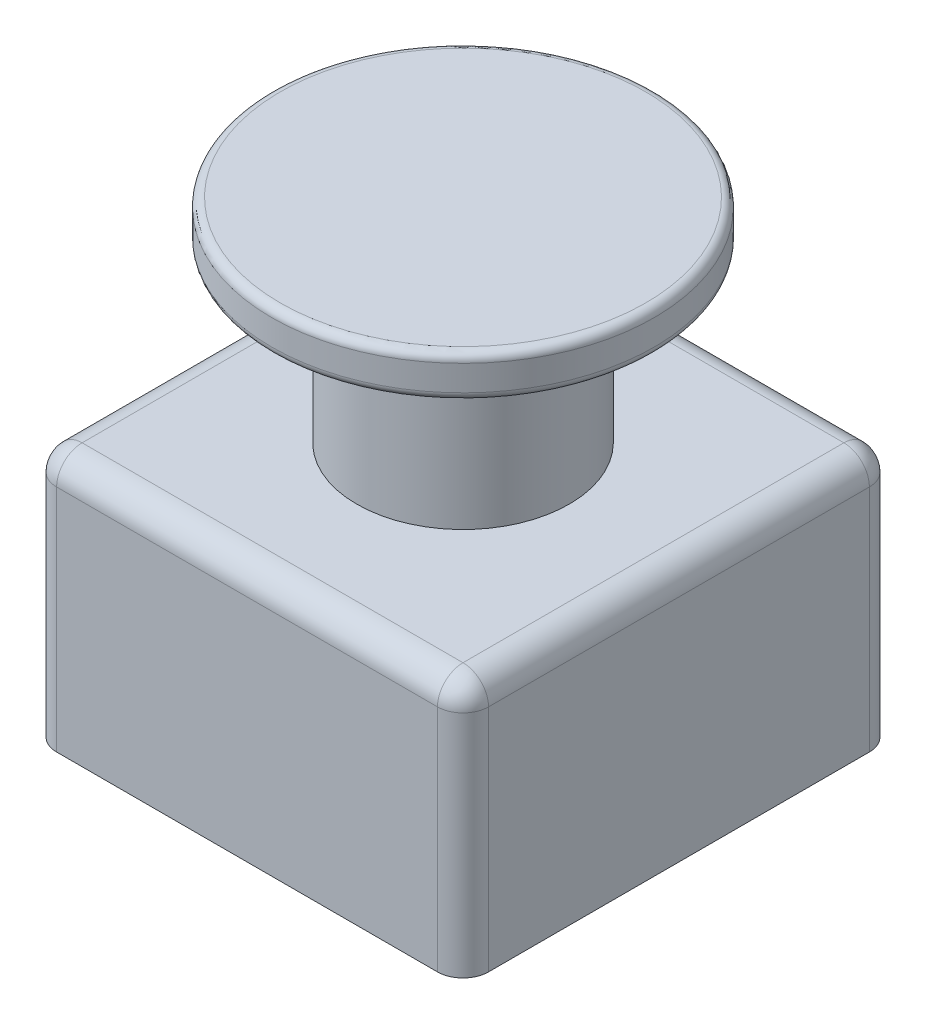
ISO-10303-21;
HEADER;
FILE_DESCRIPTION(('STEP AP214'),'2;1');
FILE_NAME('part.step','',(''),(''),'','','');
FILE_SCHEMA(('AUTOMOTIVE_DESIGN { 1 0 10303 214 1 1 1 1 }'));
ENDSEC;
DATA;
#1=APPLICATION_CONTEXT('core data for automotive mechanical design processes');
#2=APPLICATION_PROTOCOL_DEFINITION('international standard','automotive_design',2000,#1);
#3=PRODUCT_CONTEXT('',#1,'mechanical');
#4=PRODUCT('Part','Part','',(#3));
#5=PRODUCT_RELATED_PRODUCT_CATEGORY('part','',(#4));
#6=PRODUCT_DEFINITION_FORMATION('','',#4);
#7=PRODUCT_DEFINITION_CONTEXT('part definition',#1,'design');
#8=PRODUCT_DEFINITION('design','',#6,#7);
#9=PRODUCT_DEFINITION_SHAPE('','',#8);
#10=(LENGTH_UNIT() NAMED_UNIT(*) SI_UNIT(.MILLI.,.METRE.));
#11=(NAMED_UNIT(*) PLANE_ANGLE_UNIT() SI_UNIT($,.RADIAN.));
#12=(NAMED_UNIT(*) SI_UNIT($,.STERADIAN.) SOLID_ANGLE_UNIT());
#13=UNCERTAINTY_MEASURE_WITH_UNIT(LENGTH_MEASURE(1.E-05),#10,'distance_accuracy_value','');
#14=(GEOMETRIC_REPRESENTATION_CONTEXT(3) GLOBAL_UNCERTAINTY_ASSIGNED_CONTEXT((#13)) GLOBAL_UNIT_ASSIGNED_CONTEXT((#10,
#11,#12)) REPRESENTATION_CONTEXT('',''));
#15=CARTESIAN_POINT('',(0.,0.,0.));
#16=DIRECTION('',(0.,0.,1.));
#17=DIRECTION('',(1.,0.,0.));
#18=AXIS2_PLACEMENT_3D('',#15,#16,#17);
#19=CARTESIAN_POINT('',(25.4,-30.,-25.4));
#20=DIRECTION('',(1.,0.,0.));
#21=DIRECTION('',(0.,0.,-1.));
#22=AXIS2_PLACEMENT_3D('',#19,#20,#21);
#23=PLANE('',#22);
#24=DIRECTION('',(0.,0.,-1.));
#25=VECTOR('',#24,1.);
#26=CARTESIAN_POINT('',(25.4,-30.,-25.4));
#27=LINE('',#26,#25);
#28=CARTESIAN_POINT('',(25.4,-30.,22.4));
#29=VERTEX_POINT('',#28);
#30=CARTESIAN_POINT('',(25.4,-30.,-22.4));
#31=VERTEX_POINT('',#30);
#32=EDGE_CURVE('E315',#29,#31,#27,.T.);
#33=ORIENTED_EDGE('',*,*,#32,.T.);
#34=DIRECTION('',(0.,1.,0.));
#35=VECTOR('',#34,1.);
#36=CARTESIAN_POINT('',(25.4,-30.,-22.4));
#37=LINE('',#36,#35);
#38=CARTESIAN_POINT('',(25.4,-3.,-22.4));
#39=VERTEX_POINT('',#38);
#40=EDGE_CURVE('E153',#31,#39,#37,.T.);
#41=ORIENTED_EDGE('',*,*,#40,.T.);
#42=DIRECTION('',(0.,0.,-1.));
#43=VECTOR('',#42,1.);
#44=CARTESIAN_POINT('',(25.4,-3.,-25.4));
#45=LINE('',#44,#43);
#46=CARTESIAN_POINT('',(25.4,-3.,22.4));
#47=VERTEX_POINT('',#46);
#48=EDGE_CURVE('E117',#39,#47,#45,.F.);
#49=ORIENTED_EDGE('',*,*,#48,.T.);
#50=DIRECTION('',(0.,1.,0.));
#51=VECTOR('',#50,1.);
#52=CARTESIAN_POINT('',(25.4,-30.,22.4));
#53=LINE('',#52,#51);
#54=EDGE_CURVE('E146',#47,#29,#53,.F.);
#55=ORIENTED_EDGE('',*,*,#54,.T.);
#56=EDGE_LOOP('',(#33,#41,#49,#55));
#57=FACE_BOUND('',#56,.T.);
#58=ADVANCED_FACE('F33',(#57),#23,.T.);
#59=CARTESIAN_POINT('',(-25.4,-30.,25.4));
#60=DIRECTION('',(0.,0.,1.));
#61=DIRECTION('',(1.,0.,0.));
#62=AXIS2_PLACEMENT_3D('',#59,#60,#61);
#63=PLANE('',#62);
#64=DIRECTION('',(1.,0.,0.));
#65=VECTOR('',#64,1.);
#66=CARTESIAN_POINT('',(-25.4,-3.,25.4));
#67=LINE('',#66,#65);
#68=CARTESIAN_POINT('',(22.4,-3.,25.4));
#69=VERTEX_POINT('',#68);
#70=CARTESIAN_POINT('',(-22.4,-3.,25.4));
#71=VERTEX_POINT('',#70);
#72=EDGE_CURVE('E157',#69,#71,#67,.F.);
#73=ORIENTED_EDGE('',*,*,#72,.T.);
#74=DIRECTION('',(0.,1.,0.));
#75=VECTOR('',#74,1.);
#76=CARTESIAN_POINT('',(-22.4,-30.,25.4));
#77=LINE('',#76,#75);
#78=CARTESIAN_POINT('',(-22.4,-30.,25.4));
#79=VERTEX_POINT('',#78);
#80=EDGE_CURVE('E159',#71,#79,#77,.F.);
#81=ORIENTED_EDGE('',*,*,#80,.T.);
#82=DIRECTION('',(1.,0.,0.));
#83=VECTOR('',#82,1.);
#84=CARTESIAN_POINT('',(-25.4,-30.,25.4));
#85=LINE('',#84,#83);
#86=CARTESIAN_POINT('',(22.4,-30.,25.4));
#87=VERTEX_POINT('',#86);
#88=EDGE_CURVE('E308',#79,#87,#85,.T.);
#89=ORIENTED_EDGE('',*,*,#88,.T.);
#90=DIRECTION('',(0.,1.,0.));
#91=VECTOR('',#90,1.);
#92=CARTESIAN_POINT('',(22.4,-30.,25.4));
#93=LINE('',#92,#91);
#94=EDGE_CURVE('E155',#87,#69,#93,.T.);
#95=ORIENTED_EDGE('',*,*,#94,.T.);
#96=EDGE_LOOP('',(#73,#81,#89,#95));
#97=FACE_BOUND('',#96,.T.);
#98=ADVANCED_FACE('F239',(#97),#63,.T.);
#99=CARTESIAN_POINT('',(-25.4,-30.,-25.4));
#100=DIRECTION('',(-1.,0.,0.));
#101=DIRECTION('',(0.,0.,1.));
#102=AXIS2_PLACEMENT_3D('',#99,#100,#101);
#103=PLANE('',#102);
#104=DIRECTION('',(0.,0.,1.));
#105=VECTOR('',#104,1.);
#106=CARTESIAN_POINT('',(-25.4,-3.,-25.4));
#107=LINE('',#106,#105);
#108=CARTESIAN_POINT('',(-25.4,-3.,22.4));
#109=VERTEX_POINT('',#108);
#110=CARTESIAN_POINT('',(-25.4,-3.,-22.4));
#111=VERTEX_POINT('',#110);
#112=EDGE_CURVE('E163',#109,#111,#107,.F.);
#113=ORIENTED_EDGE('',*,*,#112,.T.);
#114=DIRECTION('',(0.,1.,0.));
#115=VECTOR('',#114,1.);
#116=CARTESIAN_POINT('',(-25.4,-30.,-22.4));
#117=LINE('',#116,#115);
#118=CARTESIAN_POINT('',(-25.4,-30.,-22.4));
#119=VERTEX_POINT('',#118);
#120=EDGE_CURVE('E165',#111,#119,#117,.F.);
#121=ORIENTED_EDGE('',*,*,#120,.T.);
#122=DIRECTION('',(0.,0.,1.));
#123=VECTOR('',#122,1.);
#124=CARTESIAN_POINT('',(-25.4,-30.,-25.4));
#125=LINE('',#124,#123);
#126=CARTESIAN_POINT('',(-25.4,-30.,22.4));
#127=VERTEX_POINT('',#126);
#128=EDGE_CURVE('E305',#119,#127,#125,.T.);
#129=ORIENTED_EDGE('',*,*,#128,.T.);
#130=DIRECTION('',(0.,1.,0.));
#131=VECTOR('',#130,1.);
#132=CARTESIAN_POINT('',(-25.4,-30.,22.4));
#133=LINE('',#132,#131);
#134=EDGE_CURVE('E161',#127,#109,#133,.T.);
#135=ORIENTED_EDGE('',*,*,#134,.T.);
#136=EDGE_LOOP('',(#113,#121,#129,#135));
#137=FACE_BOUND('',#136,.T.);
#138=ADVANCED_FACE('F245',(#137),#103,.T.);
#139=CARTESIAN_POINT('',(-25.4,-30.,-25.4));
#140=DIRECTION('',(0.,0.,-1.));
#141=DIRECTION('',(-1.,0.,0.));
#142=AXIS2_PLACEMENT_3D('',#139,#140,#141);
#143=PLANE('',#142);
#144=DIRECTION('',(-1.,0.,0.));
#145=VECTOR('',#144,1.);
#146=CARTESIAN_POINT('',(-25.4,-3.,-25.4));
#147=LINE('',#146,#145);
#148=CARTESIAN_POINT('',(-22.4,-3.,-25.4));
#149=VERTEX_POINT('',#148);
#150=CARTESIAN_POINT('',(22.4,-3.,-25.4));
#151=VERTEX_POINT('',#150);
#152=EDGE_CURVE('E48',#149,#151,#147,.F.);
#153=ORIENTED_EDGE('',*,*,#152,.T.);
#154=DIRECTION('',(0.,1.,0.));
#155=VECTOR('',#154,1.);
#156=CARTESIAN_POINT('',(22.4,-30.,-25.4));
#157=LINE('',#156,#155);
#158=CARTESIAN_POINT('',(22.4,-30.,-25.4));
#159=VERTEX_POINT('',#158);
#160=EDGE_CURVE('E169',#151,#159,#157,.F.);
#161=ORIENTED_EDGE('',*,*,#160,.T.);
#162=DIRECTION('',(-1.,0.,0.));
#163=VECTOR('',#162,1.);
#164=CARTESIAN_POINT('',(-25.4,-30.,-25.4));
#165=LINE('',#164,#163);
#166=CARTESIAN_POINT('',(-22.4,-30.,-25.4));
#167=VERTEX_POINT('',#166);
#168=EDGE_CURVE('E312',#159,#167,#165,.T.);
#169=ORIENTED_EDGE('',*,*,#168,.T.);
#170=DIRECTION('',(0.,1.,0.));
#171=VECTOR('',#170,1.);
#172=CARTESIAN_POINT('',(-22.4,-30.,-25.4));
#173=LINE('',#172,#171);
#174=EDGE_CURVE('E53',#167,#149,#173,.T.);
#175=ORIENTED_EDGE('',*,*,#174,.T.);
#176=EDGE_LOOP('',(#153,#161,#169,#175));
#177=FACE_BOUND('',#176,.T.);
#178=ADVANCED_FACE('F251',(#177),#143,.T.);
#179=CARTESIAN_POINT('',(0.,-30.,0.));
#180=DIRECTION('',(0.,1.,0.));
#181=DIRECTION('',(0.,0.,1.));
#182=AXIS2_PLACEMENT_3D('',#179,#180,#181);
#183=PLANE('',#182);
#184=ORIENTED_EDGE('',*,*,#168,.F.);
#185=CARTESIAN_POINT('',(22.4,-30.,-22.4));
#186=DIRECTION('',(0.,1.,0.));
#187=DIRECTION('',(0.,0.,1.));
#188=AXIS2_PLACEMENT_3D('',#185,#186,#187);
#189=CIRCLE('',#188,3.);
#190=EDGE_CURVE('E177',#159,#31,#189,.F.);
#191=ORIENTED_EDGE('',*,*,#190,.T.);
#192=ORIENTED_EDGE('',*,*,#32,.F.);
#193=CARTESIAN_POINT('',(22.4,-30.,22.4));
#194=DIRECTION('',(0.,1.,0.));
#195=DIRECTION('',(0.,0.,1.));
#196=AXIS2_PLACEMENT_3D('',#193,#194,#195);
#197=CIRCLE('',#196,3.);
#198=EDGE_CURVE('E171',#29,#87,#197,.F.);
#199=ORIENTED_EDGE('',*,*,#198,.T.);
#200=ORIENTED_EDGE('',*,*,#88,.F.);
#201=CARTESIAN_POINT('',(-22.4,-30.,22.4));
#202=DIRECTION('',(0.,1.,0.));
#203=DIRECTION('',(0.,0.,1.));
#204=AXIS2_PLACEMENT_3D('',#201,#202,#203);
#205=CIRCLE('',#204,3.);
#206=EDGE_CURVE('E173',#79,#127,#205,.F.);
#207=ORIENTED_EDGE('',*,*,#206,.T.);
#208=ORIENTED_EDGE('',*,*,#128,.F.);
#209=CARTESIAN_POINT('',(-22.4,-30.,-22.4));
#210=DIRECTION('',(0.,1.,0.));
#211=DIRECTION('',(0.,0.,1.));
#212=AXIS2_PLACEMENT_3D('',#209,#210,#211);
#213=CIRCLE('',#212,3.);
#214=EDGE_CURVE('E175',#119,#167,#213,.F.);
#215=ORIENTED_EDGE('',*,*,#214,.T.);
#216=EDGE_LOOP('',(#184,#191,#192,#199,#200,#207,#208,#215));
#217=FACE_BOUND('',#216,.T.);
#218=ADVANCED_FACE('F304',(#217),#183,.F.);
#219=CARTESIAN_POINT('',(0.,0.,0.));
#220=DIRECTION('',(0.,1.,0.));
#221=DIRECTION('',(0.,0.,1.));
#222=AXIS2_PLACEMENT_3D('',#219,#220,#221);
#223=PLANE('',#222);
#224=DIRECTION('',(1.,0.,0.));
#225=VECTOR('',#224,1.);
#226=CARTESIAN_POINT('',(0.,0.,22.4));
#227=LINE('',#226,#225);
#228=CARTESIAN_POINT('',(-22.4,0.,22.4));
#229=VERTEX_POINT('',#228);
#230=CARTESIAN_POINT('',(22.4,0.,22.4));
#231=VERTEX_POINT('',#230);
#232=EDGE_CURVE('E144',#229,#231,#227,.T.);
#233=ORIENTED_EDGE('',*,*,#232,.T.);
#234=DIRECTION('',(0.,0.,-1.));
#235=VECTOR('',#234,1.);
#236=CARTESIAN_POINT('',(22.4,0.,0.));
#237=LINE('',#236,#235);
#238=CARTESIAN_POINT('',(22.4,0.,-22.4));
#239=VERTEX_POINT('',#238);
#240=EDGE_CURVE('E115',#231,#239,#237,.T.);
#241=ORIENTED_EDGE('',*,*,#240,.T.);
#242=DIRECTION('',(-1.,0.,0.));
#243=VECTOR('',#242,1.);
#244=CARTESIAN_POINT('',(0.,0.,-22.4));
#245=LINE('',#244,#243);
#246=CARTESIAN_POINT('',(-22.4,0.,-22.4));
#247=VERTEX_POINT('',#246);
#248=EDGE_CURVE('E132',#239,#247,#245,.T.);
#249=ORIENTED_EDGE('',*,*,#248,.T.);
#250=DIRECTION('',(0.,0.,1.));
#251=VECTOR('',#250,1.);
#252=CARTESIAN_POINT('',(-22.4,0.,0.));
#253=LINE('',#252,#251);
#254=EDGE_CURVE('E138',#247,#229,#253,.T.);
#255=ORIENTED_EDGE('',*,*,#254,.T.);
#256=EDGE_LOOP('',(#233,#241,#249,#255));
#257=FACE_BOUND('',#256,.T.);
#258=CARTESIAN_POINT('',(0.,0.,0.));
#259=DIRECTION('',(0.,1.,0.));
#260=DIRECTION('',(0.,0.,1.));
#261=AXIS2_PLACEMENT_3D('',#258,#259,#260);
#262=CIRCLE('',#261,12.5);
#263=CARTESIAN_POINT('',(0.,0.,12.5));
#264=VERTEX_POINT('',#263);
#265=EDGE_CURVE('E139',#264,#264,#262,.T.);
#266=ORIENTED_EDGE('',*,*,#265,.F.);
#267=EDGE_LOOP('',(#266));
#268=FACE_BOUND('',#267,.T.);
#269=ADVANCED_FACE('F141',(#257,#268),#223,.T.);
#270=CARTESIAN_POINT('',(0.,20.,0.));
#271=DIRECTION('',(0.,-1.,0.));
#272=DIRECTION('',(0.,0.,-1.));
#273=AXIS2_PLACEMENT_3D('',#270,#271,#272);
#274=CYLINDRICAL_SURFACE('',#273,12.5);
#275=CARTESIAN_POINT('',(0.,20.,0.));
#276=DIRECTION('',(0.,1.,0.));
#277=DIRECTION('',(0.,0.,1.));
#278=AXIS2_PLACEMENT_3D('',#275,#276,#277);
#279=CIRCLE('',#278,12.5);
#280=CARTESIAN_POINT('',(0.,20.,12.5));
#281=VERTEX_POINT('',#280);
#282=EDGE_CURVE('E203',#281,#281,#279,.T.);
#283=ORIENTED_EDGE('',*,*,#282,.F.);
#284=EDGE_LOOP('',(#283));
#285=FACE_BOUND('',#284,.T.);
#286=ORIENTED_EDGE('',*,*,#265,.T.);
#287=EDGE_LOOP('',(#286));
#288=FACE_BOUND('',#287,.T.);
#289=ADVANCED_FACE('F223',(#285,#288),#274,.T.);
#290=CARTESIAN_POINT('',(0.,25.,0.));
#291=DIRECTION('',(0.,-1.,0.));
#292=DIRECTION('',(0.,0.,-1.));
#293=AXIS2_PLACEMENT_3D('',#290,#291,#292);
#294=CYLINDRICAL_SURFACE('',#293,22.5);
#295=CARTESIAN_POINT('',(0.,21.,0.));
#296=DIRECTION('',(0.,1.,0.));
#297=DIRECTION('',(0.,0.,1.));
#298=AXIS2_PLACEMENT_3D('',#295,#296,#297);
#299=CIRCLE('',#298,22.5);
#300=CARTESIAN_POINT('',(0.,21.,22.5));
#301=VERTEX_POINT('',#300);
#302=EDGE_CURVE('E206',#301,#301,#299,.T.);
#303=ORIENTED_EDGE('',*,*,#302,.T.);
#304=EDGE_LOOP('',(#303));
#305=FACE_BOUND('',#304,.T.);
#306=CARTESIAN_POINT('',(0.,24.,0.));
#307=DIRECTION('',(0.,1.,0.));
#308=DIRECTION('',(0.,0.,1.));
#309=AXIS2_PLACEMENT_3D('',#306,#307,#308);
#310=CIRCLE('',#309,22.5);
#311=CARTESIAN_POINT('',(0.,24.,22.5));
#312=VERTEX_POINT('',#311);
#313=EDGE_CURVE('E178',#312,#312,#310,.F.);
#314=ORIENTED_EDGE('',*,*,#313,.T.);
#315=EDGE_LOOP('',(#314));
#316=FACE_BOUND('',#315,.T.);
#317=ADVANCED_FACE('F219',(#305,#316),#294,.T.);
#318=CARTESIAN_POINT('',(0.,25.,0.));
#319=DIRECTION('',(0.,1.,0.));
#320=DIRECTION('',(0.,0.,1.));
#321=AXIS2_PLACEMENT_3D('',#318,#319,#320);
#322=PLANE('',#321);
#323=CARTESIAN_POINT('',(0.,25.,0.));
#324=DIRECTION('',(0.,1.,0.));
#325=DIRECTION('',(0.,0.,1.));
#326=AXIS2_PLACEMENT_3D('',#323,#324,#325);
#327=CIRCLE('',#326,21.5);
#328=CARTESIAN_POINT('',(0.,25.,21.5));
#329=VERTEX_POINT('',#328);
#330=EDGE_CURVE('E11',#329,#329,#327,.T.);
#331=ORIENTED_EDGE('',*,*,#330,.T.);
#332=EDGE_LOOP('',(#331));
#333=FACE_BOUND('',#332,.T.);
#334=ADVANCED_FACE('F222',(#333),#322,.T.);
#335=CARTESIAN_POINT('',(0.,20.,0.));
#336=DIRECTION('',(0.,1.,0.));
#337=DIRECTION('',(0.,0.,1.));
#338=AXIS2_PLACEMENT_3D('',#335,#336,#337);
#339=PLANE('',#338);
#340=CARTESIAN_POINT('',(0.,20.,0.));
#341=DIRECTION('',(0.,1.,0.));
#342=DIRECTION('',(0.,0.,1.));
#343=AXIS2_PLACEMENT_3D('',#340,#341,#342);
#344=CIRCLE('',#343,21.5);
#345=CARTESIAN_POINT('',(0.,20.,21.5));
#346=VERTEX_POINT('',#345);
#347=EDGE_CURVE('E41',#346,#346,#344,.F.);
#348=ORIENTED_EDGE('',*,*,#347,.T.);
#349=EDGE_LOOP('',(#348));
#350=FACE_BOUND('',#349,.T.);
#351=ORIENTED_EDGE('',*,*,#282,.T.);
#352=EDGE_LOOP('',(#351));
#353=FACE_BOUND('',#352,.T.);
#354=ADVANCED_FACE('F211',(#350,#353),#339,.F.);
#355=CARTESIAN_POINT('',(-22.4,-30.,22.4));
#356=DIRECTION('',(0.,1.,0.));
#357=DIRECTION('',(0.,0.,1.));
#358=AXIS2_PLACEMENT_3D('',#355,#356,#357);
#359=CYLINDRICAL_SURFACE('',#358,3.);
#360=ORIENTED_EDGE('',*,*,#206,.F.);
#361=ORIENTED_EDGE('',*,*,#80,.F.);
#362=CARTESIAN_POINT('',(-22.4,-3.,22.4));
#363=DIRECTION('',(0.,1.,0.));
#364=DIRECTION('',(0.,0.,1.));
#365=AXIS2_PLACEMENT_3D('',#362,#363,#364);
#366=CIRCLE('',#365,3.);
#367=EDGE_CURVE('E200',#109,#71,#366,.T.);
#368=ORIENTED_EDGE('',*,*,#367,.F.);
#369=ORIENTED_EDGE('',*,*,#134,.F.);
#370=EDGE_LOOP('',(#360,#361,#368,#369));
#371=FACE_BOUND('',#370,.T.);
#372=ADVANCED_FACE('F236',(#371),#359,.T.);
#373=CARTESIAN_POINT('',(-22.4,-3.,0.));
#374=DIRECTION('',(0.,0.,1.));
#375=DIRECTION('',(1.,0.,0.));
#376=AXIS2_PLACEMENT_3D('',#373,#374,#375);
#377=CYLINDRICAL_SURFACE('',#376,3.);
#378=CARTESIAN_POINT('',(-22.4,-3.,-22.4));
#379=DIRECTION('',(0.,0.,-1.));
#380=DIRECTION('',(-1.,0.,0.));
#381=AXIS2_PLACEMENT_3D('',#378,#379,#380);
#382=CIRCLE('',#381,3.);
#383=EDGE_CURVE('E194',#111,#247,#382,.T.);
#384=ORIENTED_EDGE('',*,*,#383,.F.);
#385=ORIENTED_EDGE('',*,*,#112,.F.);
#386=CARTESIAN_POINT('',(-22.4,-3.,22.4));
#387=DIRECTION('',(0.,0.,1.));
#388=DIRECTION('',(1.,0.,0.));
#389=AXIS2_PLACEMENT_3D('',#386,#387,#388);
#390=CIRCLE('',#389,3.);
#391=EDGE_CURVE('E197',#229,#109,#390,.T.);
#392=ORIENTED_EDGE('',*,*,#391,.F.);
#393=ORIENTED_EDGE('',*,*,#254,.F.);
#394=EDGE_LOOP('',(#384,#385,#392,#393));
#395=FACE_BOUND('',#394,.T.);
#396=ADVANCED_FACE('F286',(#395),#377,.T.);
#397=CARTESIAN_POINT('',(-22.4,-30.,-22.4));
#398=DIRECTION('',(0.,1.,0.));
#399=DIRECTION('',(0.,0.,1.));
#400=AXIS2_PLACEMENT_3D('',#397,#398,#399);
#401=CYLINDRICAL_SURFACE('',#400,3.);
#402=ORIENTED_EDGE('',*,*,#214,.F.);
#403=ORIENTED_EDGE('',*,*,#120,.F.);
#404=CARTESIAN_POINT('',(-22.4,-3.,-22.4));
#405=DIRECTION('',(0.,1.,0.));
#406=DIRECTION('',(0.,0.,1.));
#407=AXIS2_PLACEMENT_3D('',#404,#405,#406);
#408=CIRCLE('',#407,3.);
#409=EDGE_CURVE('E191',#149,#111,#408,.T.);
#410=ORIENTED_EDGE('',*,*,#409,.F.);
#411=ORIENTED_EDGE('',*,*,#174,.F.);
#412=EDGE_LOOP('',(#402,#403,#410,#411));
#413=FACE_BOUND('',#412,.T.);
#414=ADVANCED_FACE('F282',(#413),#401,.T.);
#415=CARTESIAN_POINT('',(-22.4,-3.,22.4));
#416=DIRECTION('',(-1.,0.,0.));
#417=DIRECTION('',(0.,0.,1.));
#418=AXIS2_PLACEMENT_3D('',#415,#416,#417);
#419=SPHERICAL_SURFACE('',#418,3.);
#420=ORIENTED_EDGE('',*,*,#391,.T.);
#421=ORIENTED_EDGE('',*,*,#367,.T.);
#422=CARTESIAN_POINT('',(-22.4,-3.,22.4));
#423=DIRECTION('',(-1.,0.,0.));
#424=DIRECTION('',(0.,0.,1.));
#425=AXIS2_PLACEMENT_3D('',#422,#423,#424);
#426=CIRCLE('',#425,3.);
#427=EDGE_CURVE('E188',#229,#71,#426,.F.);
#428=ORIENTED_EDGE('',*,*,#427,.F.);
#429=EDGE_LOOP('',(#420,#421,#428));
#430=FACE_BOUND('',#429,.T.);
#431=ADVANCED_FACE('F278',(#430),#419,.T.);
#432=CARTESIAN_POINT('',(-22.4,-3.,-22.4));
#433=DIRECTION('',(-1.,0.,0.));
#434=DIRECTION('',(0.,0.,1.));
#435=AXIS2_PLACEMENT_3D('',#432,#433,#434);
#436=SPHERICAL_SURFACE('',#435,3.);
#437=ORIENTED_EDGE('',*,*,#409,.T.);
#438=ORIENTED_EDGE('',*,*,#383,.T.);
#439=CARTESIAN_POINT('',(-22.4,-3.,-22.4));
#440=DIRECTION('',(-1.,0.,0.));
#441=DIRECTION('',(0.,0.,1.));
#442=AXIS2_PLACEMENT_3D('',#439,#440,#441);
#443=CIRCLE('',#442,3.);
#444=EDGE_CURVE('E135',#149,#247,#443,.F.);
#445=ORIENTED_EDGE('',*,*,#444,.F.);
#446=EDGE_LOOP('',(#437,#438,#445));
#447=FACE_BOUND('',#446,.T.);
#448=ADVANCED_FACE('F274',(#447),#436,.T.);
#449=CARTESIAN_POINT('',(22.4,-30.,22.4));
#450=DIRECTION('',(0.,1.,0.));
#451=DIRECTION('',(0.,0.,1.));
#452=AXIS2_PLACEMENT_3D('',#449,#450,#451);
#453=CYLINDRICAL_SURFACE('',#452,3.);
#454=ORIENTED_EDGE('',*,*,#198,.F.);
#455=ORIENTED_EDGE('',*,*,#54,.F.);
#456=CARTESIAN_POINT('',(22.4,-3.,22.4));
#457=DIRECTION('',(0.,1.,0.));
#458=DIRECTION('',(0.,0.,1.));
#459=AXIS2_PLACEMENT_3D('',#456,#457,#458);
#460=CIRCLE('',#459,3.);
#461=EDGE_CURVE('E184',#69,#47,#460,.T.);
#462=ORIENTED_EDGE('',*,*,#461,.F.);
#463=ORIENTED_EDGE('',*,*,#94,.F.);
#464=EDGE_LOOP('',(#454,#455,#462,#463));
#465=FACE_BOUND('',#464,.T.);
#466=ADVANCED_FACE('F270',(#465),#453,.T.);
#467=CARTESIAN_POINT('',(0.,-3.,22.4));
#468=DIRECTION('',(1.,0.,0.));
#469=DIRECTION('',(0.,0.,-1.));
#470=AXIS2_PLACEMENT_3D('',#467,#468,#469);
#471=CYLINDRICAL_SURFACE('',#470,3.);
#472=ORIENTED_EDGE('',*,*,#427,.T.);
#473=ORIENTED_EDGE('',*,*,#72,.F.);
#474=CARTESIAN_POINT('',(22.4,-3.,22.4));
#475=DIRECTION('',(1.,0.,0.));
#476=DIRECTION('',(0.,0.,-1.));
#477=AXIS2_PLACEMENT_3D('',#474,#475,#476);
#478=CIRCLE('',#477,3.);
#479=EDGE_CURVE('E129',#231,#69,#478,.T.);
#480=ORIENTED_EDGE('',*,*,#479,.F.);
#481=ORIENTED_EDGE('',*,*,#232,.F.);
#482=EDGE_LOOP('',(#472,#473,#480,#481));
#483=FACE_BOUND('',#482,.T.);
#484=ADVANCED_FACE('F267',(#483),#471,.T.);
#485=CARTESIAN_POINT('',(0.,-3.,-22.4));
#486=DIRECTION('',(-1.,0.,0.));
#487=DIRECTION('',(0.,0.,1.));
#488=AXIS2_PLACEMENT_3D('',#485,#486,#487);
#489=CYLINDRICAL_SURFACE('',#488,3.);
#490=ORIENTED_EDGE('',*,*,#444,.T.);
#491=ORIENTED_EDGE('',*,*,#248,.F.);
#492=CARTESIAN_POINT('',(22.4,-3.,-22.4));
#493=DIRECTION('',(1.,0.,0.));
#494=DIRECTION('',(0.,1.,0.));
#495=AXIS2_PLACEMENT_3D('',#492,#493,#494);
#496=CIRCLE('',#495,3.);
#497=EDGE_CURVE('E123',#151,#239,#496,.T.);
#498=ORIENTED_EDGE('',*,*,#497,.F.);
#499=ORIENTED_EDGE('',*,*,#152,.F.);
#500=EDGE_LOOP('',(#490,#491,#498,#499));
#501=FACE_BOUND('',#500,.T.);
#502=ADVANCED_FACE('F133',(#501),#489,.T.);
#503=CARTESIAN_POINT('',(22.4,-30.,-22.4));
#504=DIRECTION('',(0.,1.,0.));
#505=DIRECTION('',(0.,0.,1.));
#506=AXIS2_PLACEMENT_3D('',#503,#504,#505);
#507=CYLINDRICAL_SURFACE('',#506,3.);
#508=ORIENTED_EDGE('',*,*,#190,.F.);
#509=ORIENTED_EDGE('',*,*,#160,.F.);
#510=CARTESIAN_POINT('',(22.4,-3.,-22.4));
#511=DIRECTION('',(0.,1.,0.));
#512=DIRECTION('',(0.,0.,1.));
#513=AXIS2_PLACEMENT_3D('',#510,#511,#512);
#514=CIRCLE('',#513,3.);
#515=EDGE_CURVE('E127',#39,#151,#514,.T.);
#516=ORIENTED_EDGE('',*,*,#515,.F.);
#517=ORIENTED_EDGE('',*,*,#40,.F.);
#518=EDGE_LOOP('',(#508,#509,#516,#517));
#519=FACE_BOUND('',#518,.T.);
#520=ADVANCED_FACE('F260',(#519),#507,.T.);
#521=CARTESIAN_POINT('',(22.4,-3.,22.4));
#522=DIRECTION('',(0.,0.,1.));
#523=DIRECTION('',(1.,0.,0.));
#524=AXIS2_PLACEMENT_3D('',#521,#522,#523);
#525=SPHERICAL_SURFACE('',#524,3.);
#526=ORIENTED_EDGE('',*,*,#479,.T.);
#527=ORIENTED_EDGE('',*,*,#461,.T.);
#528=CARTESIAN_POINT('',(22.4,-3.,22.4));
#529=DIRECTION('',(0.,0.,1.));
#530=DIRECTION('',(1.,0.,0.));
#531=AXIS2_PLACEMENT_3D('',#528,#529,#530);
#532=CIRCLE('',#531,3.);
#533=EDGE_CURVE('E120',#231,#47,#532,.F.);
#534=ORIENTED_EDGE('',*,*,#533,.F.);
#535=EDGE_LOOP('',(#526,#527,#534));
#536=FACE_BOUND('',#535,.T.);
#537=ADVANCED_FACE('F257',(#536),#525,.T.);
#538=CARTESIAN_POINT('',(22.4,-3.,-22.4));
#539=DIRECTION('',(0.,0.,-1.));
#540=DIRECTION('',(-1.,0.,0.));
#541=AXIS2_PLACEMENT_3D('',#538,#539,#540);
#542=SPHERICAL_SURFACE('',#541,3.);
#543=ORIENTED_EDGE('',*,*,#515,.T.);
#544=ORIENTED_EDGE('',*,*,#497,.T.);
#545=CARTESIAN_POINT('',(22.4,-3.,-22.4));
#546=DIRECTION('',(0.,0.,-1.));
#547=DIRECTION('',(-1.,0.,0.));
#548=AXIS2_PLACEMENT_3D('',#545,#546,#547);
#549=CIRCLE('',#548,3.);
#550=EDGE_CURVE('E111',#39,#239,#549,.F.);
#551=ORIENTED_EDGE('',*,*,#550,.F.);
#552=EDGE_LOOP('',(#543,#544,#551));
#553=FACE_BOUND('',#552,.T.);
#554=ADVANCED_FACE('F125',(#553),#542,.T.);
#555=CARTESIAN_POINT('',(22.4,-3.,0.));
#556=DIRECTION('',(0.,0.,-1.));
#557=DIRECTION('',(-1.,0.,0.));
#558=AXIS2_PLACEMENT_3D('',#555,#556,#557);
#559=CYLINDRICAL_SURFACE('',#558,3.);
#560=ORIENTED_EDGE('',*,*,#533,.T.);
#561=ORIENTED_EDGE('',*,*,#48,.F.);
#562=ORIENTED_EDGE('',*,*,#550,.T.);
#563=ORIENTED_EDGE('',*,*,#240,.F.);
#564=EDGE_LOOP('',(#560,#561,#562,#563));
#565=FACE_BOUND('',#564,.T.);
#566=ADVANCED_FACE('F113',(#565),#559,.T.);
#567=CARTESIAN_POINT('',(0.,21.,0.));
#568=DIRECTION('',(0.,1.,0.));
#569=DIRECTION('',(0.,0.,1.));
#570=AXIS2_PLACEMENT_3D('',#567,#568,#569);
#571=TOROIDAL_SURFACE('',#570,21.5,1.);
#572=ORIENTED_EDGE('',*,*,#347,.F.);
#573=EDGE_LOOP('',(#572));
#574=FACE_BOUND('',#573,.T.);
#575=ORIENTED_EDGE('',*,*,#302,.F.);
#576=EDGE_LOOP('',(#575));
#577=FACE_BOUND('',#576,.T.);
#578=ADVANCED_FACE('F214',(#574,#577),#571,.T.);
#579=CARTESIAN_POINT('',(0.,24.,0.));
#580=DIRECTION('',(0.,1.,0.));
#581=DIRECTION('',(0.,0.,1.));
#582=AXIS2_PLACEMENT_3D('',#579,#580,#581);
#583=TOROIDAL_SURFACE('',#582,21.5,1.);
#584=ORIENTED_EDGE('',*,*,#313,.F.);
#585=EDGE_LOOP('',(#584));
#586=FACE_BOUND('',#585,.T.);
#587=ORIENTED_EDGE('',*,*,#330,.F.);
#588=EDGE_LOOP('',(#587));
#589=FACE_BOUND('',#588,.T.);
#590=ADVANCED_FACE('F35',(#586,#589),#583,.T.);
#591=CLOSED_SHELL('',(#58,#98,#138,#178,#218,#269,#289,#317,#334,#354,#372,#396,#414,#431,#448,
#466,#484,#502,#520,#537,#554,#566,#578,#590));
#592=MANIFOLD_SOLID_BREP('B2',#591);
#593=ADVANCED_BREP_SHAPE_REPRESENTATION('',(#18,#592),#14);
#594=SHAPE_DEFINITION_REPRESENTATION(#9,#593);
ENDSEC;
END-ISO-10303-21;
